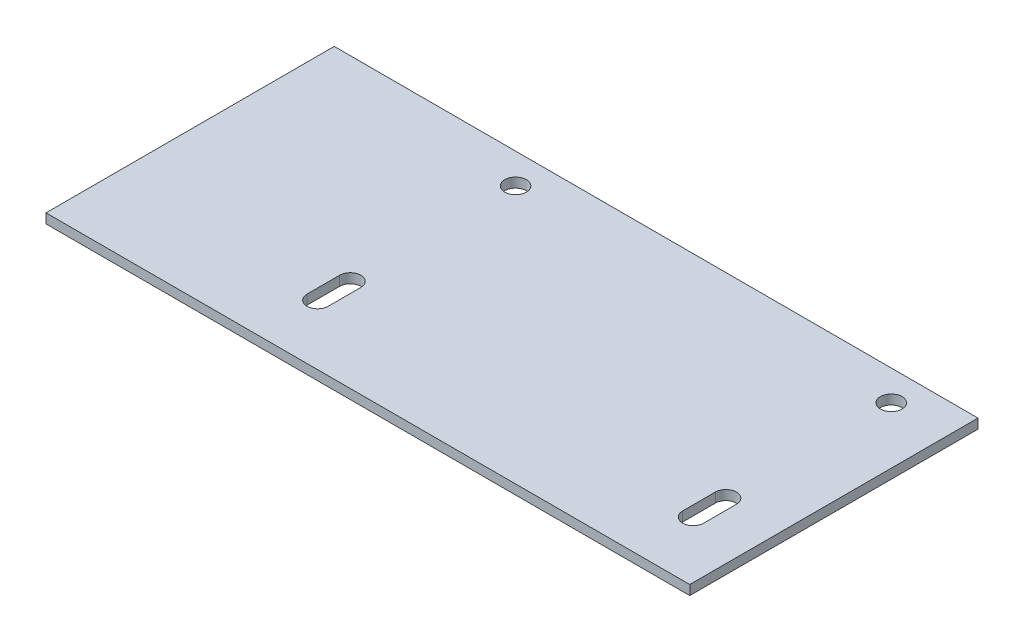
ISO-10303-21;
HEADER;
FILE_DESCRIPTION(('STEP AP214'),'2;1');
FILE_NAME('part.step','',(''),(''),'','','');
FILE_SCHEMA(('AUTOMOTIVE_DESIGN { 1 0 10303 214 1 1 1 1 }'));
ENDSEC;
DATA;
#1=APPLICATION_CONTEXT('core data for automotive mechanical design processes');
#2=APPLICATION_PROTOCOL_DEFINITION('international standard','automotive_design',2000,#1);
#3=PRODUCT_CONTEXT('',#1,'mechanical');
#4=PRODUCT('Part','Part','',(#3));
#5=PRODUCT_RELATED_PRODUCT_CATEGORY('part','',(#4));
#6=PRODUCT_DEFINITION_FORMATION('','',#4);
#7=PRODUCT_DEFINITION_CONTEXT('part definition',#1,'design');
#8=PRODUCT_DEFINITION('design','',#6,#7);
#9=PRODUCT_DEFINITION_SHAPE('','',#8);
#10=(LENGTH_UNIT() NAMED_UNIT(*) SI_UNIT(.MILLI.,.METRE.));
#11=(NAMED_UNIT(*) PLANE_ANGLE_UNIT() SI_UNIT($,.RADIAN.));
#12=(NAMED_UNIT(*) SI_UNIT($,.STERADIAN.) SOLID_ANGLE_UNIT());
#13=UNCERTAINTY_MEASURE_WITH_UNIT(LENGTH_MEASURE(1.E-05),#10,'distance_accuracy_value','');
#14=(GEOMETRIC_REPRESENTATION_CONTEXT(3) GLOBAL_UNCERTAINTY_ASSIGNED_CONTEXT((#13)) GLOBAL_UNIT_ASSIGNED_CONTEXT((#10,
#11,#12)) REPRESENTATION_CONTEXT('',''));
#15=CARTESIAN_POINT('',(0.,0.,0.));
#16=DIRECTION('',(0.,0.,1.));
#17=DIRECTION('',(1.,0.,0.));
#18=AXIS2_PLACEMENT_3D('',#15,#16,#17);
#19=CARTESIAN_POINT('',(167.5,5.,75.));
#20=DIRECTION('',(-1.,0.,0.));
#21=DIRECTION('',(0.,0.,1.));
#22=AXIS2_PLACEMENT_3D('',#19,#20,#21);
#23=PLANE('',#22);
#24=DIRECTION('',(0.,0.,-1.));
#25=VECTOR('',#24,1.);
#26=CARTESIAN_POINT('',(167.5,0.,75.));
#27=LINE('',#26,#25);
#28=CARTESIAN_POINT('',(167.5,0.,75.));
#29=VERTEX_POINT('',#28);
#30=CARTESIAN_POINT('',(167.5,0.,-75.));
#31=VERTEX_POINT('',#30);
#32=EDGE_CURVE('E189',#29,#31,#27,.T.);
#33=ORIENTED_EDGE('',*,*,#32,.T.);
#34=DIRECTION('',(0.,-1.,0.));
#35=VECTOR('',#34,1.);
#36=CARTESIAN_POINT('',(167.5,5.,-75.));
#37=LINE('',#36,#35);
#38=CARTESIAN_POINT('',(167.5,5.,-75.));
#39=VERTEX_POINT('',#38);
#40=EDGE_CURVE('E206',#39,#31,#37,.T.);
#41=ORIENTED_EDGE('',*,*,#40,.F.);
#42=DIRECTION('',(0.,0.,-1.));
#43=VECTOR('',#42,1.);
#44=CARTESIAN_POINT('',(167.5,5.,75.));
#45=LINE('',#44,#43);
#46=CARTESIAN_POINT('',(167.5,5.,75.));
#47=VERTEX_POINT('',#46);
#48=EDGE_CURVE('E178',#47,#39,#45,.T.);
#49=ORIENTED_EDGE('',*,*,#48,.F.);
#50=DIRECTION('',(0.,-1.,0.));
#51=VECTOR('',#50,1.);
#52=CARTESIAN_POINT('',(167.5,5.,75.));
#53=LINE('',#52,#51);
#54=EDGE_CURVE('E188',#47,#29,#53,.T.);
#55=ORIENTED_EDGE('',*,*,#54,.T.);
#56=EDGE_LOOP('',(#33,#41,#49,#55));
#57=FACE_BOUND('',#56,.T.);
#58=ADVANCED_FACE('F41',(#57),#23,.F.);
#59=CARTESIAN_POINT('',(-167.5,5.,-75.));
#60=DIRECTION('',(0.,0.,1.));
#61=DIRECTION('',(1.,0.,0.));
#62=AXIS2_PLACEMENT_3D('',#59,#60,#61);
#63=PLANE('',#62);
#64=DIRECTION('',(-1.,0.,0.));
#65=VECTOR('',#64,1.);
#66=CARTESIAN_POINT('',(-167.5,0.,-75.));
#67=LINE('',#66,#65);
#68=CARTESIAN_POINT('',(-167.5,0.,-75.));
#69=VERTEX_POINT('',#68);
#70=EDGE_CURVE('E192',#31,#69,#67,.T.);
#71=ORIENTED_EDGE('',*,*,#70,.T.);
#72=DIRECTION('',(0.,-1.,0.));
#73=VECTOR('',#72,1.);
#74=CARTESIAN_POINT('',(-167.5,5.,-75.));
#75=LINE('',#74,#73);
#76=CARTESIAN_POINT('',(-167.5,5.,-75.));
#77=VERTEX_POINT('',#76);
#78=EDGE_CURVE('E203',#77,#69,#75,.T.);
#79=ORIENTED_EDGE('',*,*,#78,.F.);
#80=DIRECTION('',(-1.,0.,0.));
#81=VECTOR('',#80,1.);
#82=CARTESIAN_POINT('',(-167.5,5.,-75.));
#83=LINE('',#82,#81);
#84=EDGE_CURVE('E181',#39,#77,#83,.T.);
#85=ORIENTED_EDGE('',*,*,#84,.F.);
#86=ORIENTED_EDGE('',*,*,#40,.T.);
#87=EDGE_LOOP('',(#71,#79,#85,#86));
#88=FACE_BOUND('',#87,.T.);
#89=ADVANCED_FACE('F260',(#88),#63,.F.);
#90=CARTESIAN_POINT('',(-167.5,5.,75.));
#91=DIRECTION('',(1.,0.,0.));
#92=DIRECTION('',(0.,0.,-1.));
#93=AXIS2_PLACEMENT_3D('',#90,#91,#92);
#94=PLANE('',#93);
#95=DIRECTION('',(0.,0.,1.));
#96=VECTOR('',#95,1.);
#97=CARTESIAN_POINT('',(-167.5,0.,75.));
#98=LINE('',#97,#96);
#99=CARTESIAN_POINT('',(-167.5,0.,75.));
#100=VERTEX_POINT('',#99);
#101=EDGE_CURVE('E195',#69,#100,#98,.T.);
#102=ORIENTED_EDGE('',*,*,#101,.T.);
#103=DIRECTION('',(0.,-1.,0.));
#104=VECTOR('',#103,1.);
#105=CARTESIAN_POINT('',(-167.5,5.,75.));
#106=LINE('',#105,#104);
#107=CARTESIAN_POINT('',(-167.5,5.,75.));
#108=VERTEX_POINT('',#107);
#109=EDGE_CURVE('E200',#108,#100,#106,.T.);
#110=ORIENTED_EDGE('',*,*,#109,.F.);
#111=DIRECTION('',(0.,0.,1.));
#112=VECTOR('',#111,1.);
#113=CARTESIAN_POINT('',(-167.5,5.,75.));
#114=LINE('',#113,#112);
#115=EDGE_CURVE('E184',#77,#108,#114,.T.);
#116=ORIENTED_EDGE('',*,*,#115,.F.);
#117=ORIENTED_EDGE('',*,*,#78,.T.);
#118=EDGE_LOOP('',(#102,#110,#116,#117));
#119=FACE_BOUND('',#118,.T.);
#120=ADVANCED_FACE('F265',(#119),#94,.F.);
#121=CARTESIAN_POINT('',(-167.5,5.,75.));
#122=DIRECTION('',(0.,0.,-1.));
#123=DIRECTION('',(-1.,0.,0.));
#124=AXIS2_PLACEMENT_3D('',#121,#122,#123);
#125=PLANE('',#124);
#126=DIRECTION('',(1.,0.,0.));
#127=VECTOR('',#126,1.);
#128=CARTESIAN_POINT('',(-167.5,0.,75.));
#129=LINE('',#128,#127);
#130=EDGE_CURVE('E182',#100,#29,#129,.T.);
#131=ORIENTED_EDGE('',*,*,#130,.T.);
#132=ORIENTED_EDGE('',*,*,#54,.F.);
#133=DIRECTION('',(1.,0.,0.));
#134=VECTOR('',#133,1.);
#135=CARTESIAN_POINT('',(-167.5,5.,75.));
#136=LINE('',#135,#134);
#137=EDGE_CURVE('E186',#108,#47,#136,.T.);
#138=ORIENTED_EDGE('',*,*,#137,.F.);
#139=ORIENTED_EDGE('',*,*,#109,.T.);
#140=EDGE_LOOP('',(#131,#132,#138,#139));
#141=FACE_BOUND('',#140,.T.);
#142=ADVANCED_FACE('F247',(#141),#125,.F.);
#143=CARTESIAN_POINT('',(0.,5.,0.));
#144=DIRECTION('',(0.,-1.,0.));
#145=DIRECTION('',(0.,0.,-1.));
#146=AXIS2_PLACEMENT_3D('',#143,#144,#145);
#147=PLANE('',#146);
#148=DIRECTION('',(0.,0.,1.));
#149=VECTOR('',#148,1.);
#150=CARTESIAN_POINT('',(-62.96,5.,26.69));
#151=LINE('',#150,#149);
#152=CARTESIAN_POINT('',(-62.96,5.,26.69));
#153=VERTEX_POINT('',#152);
#154=CARTESIAN_POINT('',(-62.96,5.,43.69));
#155=VERTEX_POINT('',#154);
#156=EDGE_CURVE('E151',#153,#155,#151,.T.);
#157=ORIENTED_EDGE('',*,*,#156,.F.);
#158=CARTESIAN_POINT('',(-57.46,5.,26.69));
#159=DIRECTION('',(0.,1.,0.));
#160=DIRECTION('',(0.,0.,1.));
#161=AXIS2_PLACEMENT_3D('',#158,#159,#160);
#162=CIRCLE('',#161,5.5);
#163=CARTESIAN_POINT('',(-51.96,5.,26.69));
#164=VERTEX_POINT('',#163);
#165=EDGE_CURVE('E55',#164,#153,#162,.T.);
#166=ORIENTED_EDGE('',*,*,#165,.F.);
#167=DIRECTION('',(0.,0.,-1.));
#168=VECTOR('',#167,1.);
#169=CARTESIAN_POINT('',(-51.96,5.,26.69));
#170=LINE('',#169,#168);
#171=CARTESIAN_POINT('',(-51.96,5.,43.69));
#172=VERTEX_POINT('',#171);
#173=EDGE_CURVE('E138',#172,#164,#170,.T.);
#174=ORIENTED_EDGE('',*,*,#173,.F.);
#175=CARTESIAN_POINT('',(-57.46,5.,43.69));
#176=DIRECTION('',(0.,1.,0.));
#177=DIRECTION('',(0.,0.,1.));
#178=AXIS2_PLACEMENT_3D('',#175,#176,#177);
#179=CIRCLE('',#178,5.5);
#180=EDGE_CURVE('E144',#155,#172,#179,.T.);
#181=ORIENTED_EDGE('',*,*,#180,.F.);
#182=EDGE_LOOP('',(#157,#166,#174,#181));
#183=FACE_BOUND('',#182,.T.);
#184=CARTESIAN_POINT('',(138.025,5.,-59.315));
#185=DIRECTION('',(0.,1.,0.));
#186=DIRECTION('',(0.,0.,1.));
#187=AXIS2_PLACEMENT_3D('',#184,#185,#186);
#188=CIRCLE('',#187,5.625);
#189=CARTESIAN_POINT('',(138.025,5.,-53.69));
#190=VERTEX_POINT('',#189);
#191=EDGE_CURVE('E135',#190,#190,#188,.T.);
#192=ORIENTED_EDGE('',*,*,#191,.F.);
#193=EDGE_LOOP('',(#192));
#194=FACE_BOUND('',#193,.T.);
#195=CARTESIAN_POINT('',(-57.465,5.,-59.315));
#196=DIRECTION('',(0.,1.,0.));
#197=DIRECTION('',(0.,0.,1.));
#198=AXIS2_PLACEMENT_3D('',#195,#196,#197);
#199=CIRCLE('',#198,5.625);
#200=CARTESIAN_POINT('',(-57.465,5.,-53.69));
#201=VERTEX_POINT('',#200);
#202=EDGE_CURVE('E159',#201,#201,#199,.T.);
#203=ORIENTED_EDGE('',*,*,#202,.F.);
#204=EDGE_LOOP('',(#203));
#205=FACE_BOUND('',#204,.T.);
#206=DIRECTION('',(0.,0.,1.));
#207=VECTOR('',#206,1.);
#208=CARTESIAN_POINT('',(132.49,5.,26.69));
#209=LINE('',#208,#207);
#210=CARTESIAN_POINT('',(132.49,5.,26.69));
#211=VERTEX_POINT('',#210);
#212=CARTESIAN_POINT('',(132.49,5.,43.69));
#213=VERTEX_POINT('',#212);
#214=EDGE_CURVE('E153',#211,#213,#209,.T.);
#215=ORIENTED_EDGE('',*,*,#214,.F.);
#216=CARTESIAN_POINT('',(137.99,5.,26.69));
#217=DIRECTION('',(0.,1.,0.));
#218=DIRECTION('',(0.,0.,1.));
#219=AXIS2_PLACEMENT_3D('',#216,#217,#218);
#220=CIRCLE('',#219,5.50000000000001);
#221=CARTESIAN_POINT('',(143.49,5.,26.69));
#222=VERTEX_POINT('',#221);
#223=EDGE_CURVE('E63',#222,#211,#220,.T.);
#224=ORIENTED_EDGE('',*,*,#223,.F.);
#225=DIRECTION('',(0.,0.,-1.));
#226=VECTOR('',#225,1.);
#227=CARTESIAN_POINT('',(143.49,5.,26.69));
#228=LINE('',#227,#226);
#229=CARTESIAN_POINT('',(143.49,5.,43.69));
#230=VERTEX_POINT('',#229);
#231=EDGE_CURVE('E166',#230,#222,#228,.T.);
#232=ORIENTED_EDGE('',*,*,#231,.F.);
#233=CARTESIAN_POINT('',(137.99,5.,43.69));
#234=DIRECTION('',(0.,1.,0.));
#235=DIRECTION('',(0.,0.,1.));
#236=AXIS2_PLACEMENT_3D('',#233,#234,#235);
#237=CIRCLE('',#236,5.50000000000001);
#238=EDGE_CURVE('E163',#213,#230,#237,.T.);
#239=ORIENTED_EDGE('',*,*,#238,.F.);
#240=EDGE_LOOP('',(#215,#224,#232,#239));
#241=FACE_BOUND('',#240,.T.);
#242=ORIENTED_EDGE('',*,*,#48,.T.);
#243=ORIENTED_EDGE('',*,*,#84,.T.);
#244=ORIENTED_EDGE('',*,*,#115,.T.);
#245=ORIENTED_EDGE('',*,*,#137,.T.);
#246=EDGE_LOOP('',(#242,#243,#244,#245));
#247=FACE_BOUND('',#246,.T.);
#248=ADVANCED_FACE('F148',(#183,#194,#205,#241,#247),#147,.F.);
#249=CARTESIAN_POINT('',(0.,0.,0.));
#250=DIRECTION('',(0.,-1.,0.));
#251=DIRECTION('',(0.,0.,-1.));
#252=AXIS2_PLACEMENT_3D('',#249,#250,#251);
#253=PLANE('',#252);
#254=CARTESIAN_POINT('',(-57.46,0.,26.69));
#255=DIRECTION('',(0.,-1.,0.));
#256=DIRECTION('',(0.,0.,-1.));
#257=AXIS2_PLACEMENT_3D('',#254,#255,#256);
#258=CIRCLE('',#257,5.5);
#259=CARTESIAN_POINT('',(-62.96,0.,26.69));
#260=VERTEX_POINT('',#259);
#261=CARTESIAN_POINT('',(-51.96,0.,26.69));
#262=VERTEX_POINT('',#261);
#263=EDGE_CURVE('E11',#260,#262,#258,.T.);
#264=ORIENTED_EDGE('',*,*,#263,.F.);
#265=DIRECTION('',(0.,0.,-1.));
#266=VECTOR('',#265,1.);
#267=CARTESIAN_POINT('',(-62.96,0.,0.));
#268=LINE('',#267,#266);
#269=CARTESIAN_POINT('',(-62.96,0.,43.69));
#270=VERTEX_POINT('',#269);
#271=EDGE_CURVE('E218',#270,#260,#268,.T.);
#272=ORIENTED_EDGE('',*,*,#271,.F.);
#273=CARTESIAN_POINT('',(-57.46,0.,43.69));
#274=DIRECTION('',(0.,-1.,0.));
#275=DIRECTION('',(0.,0.,-1.));
#276=AXIS2_PLACEMENT_3D('',#273,#274,#275);
#277=CIRCLE('',#276,5.5);
#278=CARTESIAN_POINT('',(-51.96,0.,43.69));
#279=VERTEX_POINT('',#278);
#280=EDGE_CURVE('E224',#279,#270,#277,.T.);
#281=ORIENTED_EDGE('',*,*,#280,.F.);
#282=DIRECTION('',(0.,0.,1.));
#283=VECTOR('',#282,1.);
#284=CARTESIAN_POINT('',(-51.96,0.,0.));
#285=LINE('',#284,#283);
#286=EDGE_CURVE('E48',#262,#279,#285,.T.);
#287=ORIENTED_EDGE('',*,*,#286,.F.);
#288=EDGE_LOOP('',(#264,#272,#281,#287));
#289=FACE_BOUND('',#288,.T.);
#290=CARTESIAN_POINT('',(138.025,0.,-59.315));
#291=DIRECTION('',(0.,-1.,0.));
#292=DIRECTION('',(0.,0.,-1.));
#293=AXIS2_PLACEMENT_3D('',#290,#291,#292);
#294=CIRCLE('',#293,5.625);
#295=CARTESIAN_POINT('',(138.025,0.,-64.94));
#296=VERTEX_POINT('',#295);
#297=EDGE_CURVE('E193',#296,#296,#294,.T.);
#298=ORIENTED_EDGE('',*,*,#297,.F.);
#299=EDGE_LOOP('',(#298));
#300=FACE_BOUND('',#299,.T.);
#301=CARTESIAN_POINT('',(-57.465,0.,-59.315));
#302=DIRECTION('',(0.,-1.,0.));
#303=DIRECTION('',(0.,0.,-1.));
#304=AXIS2_PLACEMENT_3D('',#301,#302,#303);
#305=CIRCLE('',#304,5.625);
#306=CARTESIAN_POINT('',(-57.465,0.,-64.94));
#307=VERTEX_POINT('',#306);
#308=EDGE_CURVE('E172',#307,#307,#305,.T.);
#309=ORIENTED_EDGE('',*,*,#308,.F.);
#310=EDGE_LOOP('',(#309));
#311=FACE_BOUND('',#310,.T.);
#312=CARTESIAN_POINT('',(137.99,0.,26.69));
#313=DIRECTION('',(0.,-1.,0.));
#314=DIRECTION('',(0.,0.,-1.));
#315=AXIS2_PLACEMENT_3D('',#312,#313,#314);
#316=CIRCLE('',#315,5.50000000000001);
#317=CARTESIAN_POINT('',(132.49,0.,26.69));
#318=VERTEX_POINT('',#317);
#319=CARTESIAN_POINT('',(143.49,0.,26.69));
#320=VERTEX_POINT('',#319);
#321=EDGE_CURVE('E216',#318,#320,#316,.T.);
#322=ORIENTED_EDGE('',*,*,#321,.F.);
#323=DIRECTION('',(0.,0.,-1.));
#324=VECTOR('',#323,1.);
#325=CARTESIAN_POINT('',(132.49,0.,0.));
#326=LINE('',#325,#324);
#327=CARTESIAN_POINT('',(132.49,0.,43.69));
#328=VERTEX_POINT('',#327);
#329=EDGE_CURVE('E209',#328,#318,#326,.T.);
#330=ORIENTED_EDGE('',*,*,#329,.F.);
#331=CARTESIAN_POINT('',(137.99,0.,43.69));
#332=DIRECTION('',(0.,-1.,0.));
#333=DIRECTION('',(0.,0.,-1.));
#334=AXIS2_PLACEMENT_3D('',#331,#332,#333);
#335=CIRCLE('',#334,5.50000000000001);
#336=CARTESIAN_POINT('',(143.49,0.,43.69));
#337=VERTEX_POINT('',#336);
#338=EDGE_CURVE('E211',#337,#328,#335,.T.);
#339=ORIENTED_EDGE('',*,*,#338,.F.);
#340=DIRECTION('',(0.,0.,1.));
#341=VECTOR('',#340,1.);
#342=CARTESIAN_POINT('',(143.49,0.,0.));
#343=LINE('',#342,#341);
#344=EDGE_CURVE('E214',#320,#337,#343,.T.);
#345=ORIENTED_EDGE('',*,*,#344,.F.);
#346=EDGE_LOOP('',(#322,#330,#339,#345));
#347=FACE_BOUND('',#346,.T.);
#348=ORIENTED_EDGE('',*,*,#32,.F.);
#349=ORIENTED_EDGE('',*,*,#130,.F.);
#350=ORIENTED_EDGE('',*,*,#101,.F.);
#351=ORIENTED_EDGE('',*,*,#70,.F.);
#352=EDGE_LOOP('',(#348,#349,#350,#351));
#353=FACE_BOUND('',#352,.T.);
#354=ADVANCED_FACE('F233',(#289,#300,#311,#347,#353),#253,.T.);
#355=CARTESIAN_POINT('',(137.99,-5.,26.69));
#356=DIRECTION('',(0.,1.,0.));
#357=DIRECTION('',(0.,0.,1.));
#358=AXIS2_PLACEMENT_3D('',#355,#356,#357);
#359=CYLINDRICAL_SURFACE('',#358,5.50000000000001);
#360=ORIENTED_EDGE('',*,*,#321,.T.);
#361=DIRECTION('',(0.,1.,0.));
#362=VECTOR('',#361,1.);
#363=CARTESIAN_POINT('',(143.49,-5.,26.69));
#364=LINE('',#363,#362);
#365=EDGE_CURVE('E170',#320,#222,#364,.T.);
#366=ORIENTED_EDGE('',*,*,#365,.T.);
#367=ORIENTED_EDGE('',*,*,#223,.T.);
#368=DIRECTION('',(0.,1.,0.));
#369=VECTOR('',#368,1.);
#370=CARTESIAN_POINT('',(132.49,-5.,26.69));
#371=LINE('',#370,#369);
#372=EDGE_CURVE('E169',#318,#211,#371,.T.);
#373=ORIENTED_EDGE('',*,*,#372,.F.);
#374=EDGE_LOOP('',(#360,#366,#367,#373));
#375=FACE_BOUND('',#374,.T.);
#376=ADVANCED_FACE('F270',(#375),#359,.F.);
#377=CARTESIAN_POINT('',(143.49,-5.,26.69));
#378=DIRECTION('',(1.,0.,0.));
#379=DIRECTION('',(0.,0.,-1.));
#380=AXIS2_PLACEMENT_3D('',#377,#378,#379);
#381=PLANE('',#380);
#382=ORIENTED_EDGE('',*,*,#344,.T.);
#383=DIRECTION('',(0.,1.,0.));
#384=VECTOR('',#383,1.);
#385=CARTESIAN_POINT('',(143.49,-5.,43.69));
#386=LINE('',#385,#384);
#387=EDGE_CURVE('E173',#337,#230,#386,.T.);
#388=ORIENTED_EDGE('',*,*,#387,.T.);
#389=ORIENTED_EDGE('',*,*,#231,.T.);
#390=ORIENTED_EDGE('',*,*,#365,.F.);
#391=EDGE_LOOP('',(#382,#388,#389,#390));
#392=FACE_BOUND('',#391,.T.);
#393=ADVANCED_FACE('F275',(#392),#381,.F.);
#394=CARTESIAN_POINT('',(137.99,-5.,43.69));
#395=DIRECTION('',(0.,1.,0.));
#396=DIRECTION('',(0.,0.,1.));
#397=AXIS2_PLACEMENT_3D('',#394,#395,#396);
#398=CYLINDRICAL_SURFACE('',#397,5.50000000000001);
#399=ORIENTED_EDGE('',*,*,#338,.T.);
#400=DIRECTION('',(0.,1.,0.));
#401=VECTOR('',#400,1.);
#402=CARTESIAN_POINT('',(132.49,-5.,43.69));
#403=LINE('',#402,#401);
#404=EDGE_CURVE('E175',#328,#213,#403,.T.);
#405=ORIENTED_EDGE('',*,*,#404,.T.);
#406=ORIENTED_EDGE('',*,*,#238,.T.);
#407=ORIENTED_EDGE('',*,*,#387,.F.);
#408=EDGE_LOOP('',(#399,#405,#406,#407));
#409=FACE_BOUND('',#408,.T.);
#410=ADVANCED_FACE('F316',(#409),#398,.F.);
#411=CARTESIAN_POINT('',(132.49,-5.,26.69));
#412=DIRECTION('',(-1.,0.,0.));
#413=DIRECTION('',(0.,0.,1.));
#414=AXIS2_PLACEMENT_3D('',#411,#412,#413);
#415=PLANE('',#414);
#416=ORIENTED_EDGE('',*,*,#329,.T.);
#417=ORIENTED_EDGE('',*,*,#372,.T.);
#418=ORIENTED_EDGE('',*,*,#214,.T.);
#419=ORIENTED_EDGE('',*,*,#404,.F.);
#420=EDGE_LOOP('',(#416,#417,#418,#419));
#421=FACE_BOUND('',#420,.T.);
#422=ADVANCED_FACE('F326',(#421),#415,.F.);
#423=CARTESIAN_POINT('',(-57.465,-5.,-59.315));
#424=DIRECTION('',(0.,1.,0.));
#425=DIRECTION('',(0.,0.,1.));
#426=AXIS2_PLACEMENT_3D('',#423,#424,#425);
#427=CYLINDRICAL_SURFACE('',#426,5.625);
#428=ORIENTED_EDGE('',*,*,#308,.T.);
#429=EDGE_LOOP('',(#428));
#430=FACE_BOUND('',#429,.T.);
#431=ORIENTED_EDGE('',*,*,#202,.T.);
#432=EDGE_LOOP('',(#431));
#433=FACE_BOUND('',#432,.T.);
#434=ADVANCED_FACE('F243',(#430,#433),#427,.F.);
#435=CARTESIAN_POINT('',(138.025,-5.,-59.315));
#436=DIRECTION('',(0.,1.,0.));
#437=DIRECTION('',(0.,0.,1.));
#438=AXIS2_PLACEMENT_3D('',#435,#436,#437);
#439=CYLINDRICAL_SURFACE('',#438,5.625);
#440=ORIENTED_EDGE('',*,*,#297,.T.);
#441=EDGE_LOOP('',(#440));
#442=FACE_BOUND('',#441,.T.);
#443=ORIENTED_EDGE('',*,*,#191,.T.);
#444=EDGE_LOOP('',(#443));
#445=FACE_BOUND('',#444,.T.);
#446=ADVANCED_FACE('F345',(#442,#445),#439,.F.);
#447=CARTESIAN_POINT('',(-57.46,-5.,26.69));
#448=DIRECTION('',(0.,1.,0.));
#449=DIRECTION('',(0.,0.,1.));
#450=AXIS2_PLACEMENT_3D('',#447,#448,#449);
#451=CYLINDRICAL_SURFACE('',#450,5.5);
#452=ORIENTED_EDGE('',*,*,#263,.T.);
#453=DIRECTION('',(0.,1.,0.));
#454=VECTOR('',#453,1.);
#455=CARTESIAN_POINT('',(-51.96,-5.,26.69));
#456=LINE('',#455,#454);
#457=EDGE_CURVE('E128',#262,#164,#456,.T.);
#458=ORIENTED_EDGE('',*,*,#457,.T.);
#459=ORIENTED_EDGE('',*,*,#165,.T.);
#460=DIRECTION('',(0.,1.,0.));
#461=VECTOR('',#460,1.);
#462=CARTESIAN_POINT('',(-62.96,-5.,26.69));
#463=LINE('',#462,#461);
#464=EDGE_CURVE('E145',#260,#153,#463,.T.);
#465=ORIENTED_EDGE('',*,*,#464,.F.);
#466=EDGE_LOOP('',(#452,#458,#459,#465));
#467=FACE_BOUND('',#466,.T.);
#468=ADVANCED_FACE('F130',(#467),#451,.F.);
#469=CARTESIAN_POINT('',(-51.96,-5.,26.69));
#470=DIRECTION('',(1.,0.,0.));
#471=DIRECTION('',(0.,0.,-1.));
#472=AXIS2_PLACEMENT_3D('',#469,#470,#471);
#473=PLANE('',#472);
#474=ORIENTED_EDGE('',*,*,#286,.T.);
#475=DIRECTION('',(0.,1.,0.));
#476=VECTOR('',#475,1.);
#477=CARTESIAN_POINT('',(-51.96,-5.,43.69));
#478=LINE('',#477,#476);
#479=EDGE_CURVE('E134',#279,#172,#478,.T.);
#480=ORIENTED_EDGE('',*,*,#479,.T.);
#481=ORIENTED_EDGE('',*,*,#173,.T.);
#482=ORIENTED_EDGE('',*,*,#457,.F.);
#483=EDGE_LOOP('',(#474,#480,#481,#482));
#484=FACE_BOUND('',#483,.T.);
#485=ADVANCED_FACE('F139',(#484),#473,.F.);
#486=CARTESIAN_POINT('',(-57.46,-5.,43.69));
#487=DIRECTION('',(0.,1.,0.));
#488=DIRECTION('',(0.,0.,1.));
#489=AXIS2_PLACEMENT_3D('',#486,#487,#488);
#490=CYLINDRICAL_SURFACE('',#489,5.5);
#491=ORIENTED_EDGE('',*,*,#280,.T.);
#492=DIRECTION('',(0.,1.,0.));
#493=VECTOR('',#492,1.);
#494=CARTESIAN_POINT('',(-62.96,-5.,43.69));
#495=LINE('',#494,#493);
#496=EDGE_CURVE('E231',#270,#155,#495,.T.);
#497=ORIENTED_EDGE('',*,*,#496,.T.);
#498=ORIENTED_EDGE('',*,*,#180,.T.);
#499=ORIENTED_EDGE('',*,*,#479,.F.);
#500=EDGE_LOOP('',(#491,#497,#498,#499));
#501=FACE_BOUND('',#500,.T.);
#502=ADVANCED_FACE('F229',(#501),#490,.F.);
#503=CARTESIAN_POINT('',(-62.96,-5.,26.69));
#504=DIRECTION('',(-1.,0.,0.));
#505=DIRECTION('',(0.,0.,1.));
#506=AXIS2_PLACEMENT_3D('',#503,#504,#505);
#507=PLANE('',#506);
#508=ORIENTED_EDGE('',*,*,#271,.T.);
#509=ORIENTED_EDGE('',*,*,#464,.T.);
#510=ORIENTED_EDGE('',*,*,#156,.T.);
#511=ORIENTED_EDGE('',*,*,#496,.F.);
#512=EDGE_LOOP('',(#508,#509,#510,#511));
#513=FACE_BOUND('',#512,.T.);
#514=ADVANCED_FACE('F236',(#513),#507,.F.);
#515=CLOSED_SHELL('',(#58,#89,#120,#142,#248,#354,#376,#393,#410,#422,#434,#446,#468,#485,#502,#514));
#516=MANIFOLD_SOLID_BREP('B2',#515);
#517=ADVANCED_BREP_SHAPE_REPRESENTATION('',(#18,#516),#14);
#518=SHAPE_DEFINITION_REPRESENTATION(#9,#517);
ENDSEC;
END-ISO-10303-21;
